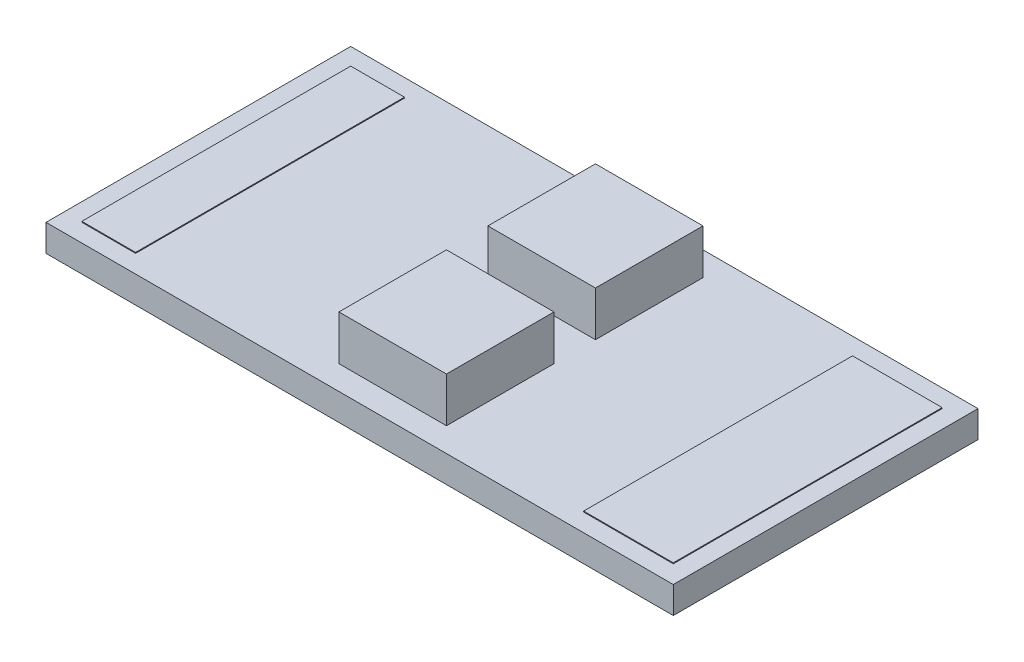
ISO-10303-21;
HEADER;
FILE_DESCRIPTION(('STEP AP214'),'2;1');
FILE_NAME('part.step','',(''),(''),'','','');
FILE_SCHEMA(('AUTOMOTIVE_DESIGN { 1 0 10303 214 1 1 1 1 }'));
ENDSEC;
DATA;
#1=APPLICATION_CONTEXT('core data for automotive mechanical design processes');
#2=APPLICATION_PROTOCOL_DEFINITION('international standard','automotive_design',2000,#1);
#3=PRODUCT_CONTEXT('',#1,'mechanical');
#4=PRODUCT('Part','Part','',(#3));
#5=PRODUCT_RELATED_PRODUCT_CATEGORY('part','',(#4));
#6=PRODUCT_DEFINITION_FORMATION('','',#4);
#7=PRODUCT_DEFINITION_CONTEXT('part definition',#1,'design');
#8=PRODUCT_DEFINITION('design','',#6,#7);
#9=PRODUCT_DEFINITION_SHAPE('','',#8);
#10=(LENGTH_UNIT() NAMED_UNIT(*) SI_UNIT(.MILLI.,.METRE.));
#11=(NAMED_UNIT(*) PLANE_ANGLE_UNIT() SI_UNIT($,.RADIAN.));
#12=(NAMED_UNIT(*) SI_UNIT($,.STERADIAN.) SOLID_ANGLE_UNIT());
#13=UNCERTAINTY_MEASURE_WITH_UNIT(LENGTH_MEASURE(1.E-05),#10,'distance_accuracy_value','');
#14=(GEOMETRIC_REPRESENTATION_CONTEXT(3) GLOBAL_UNCERTAINTY_ASSIGNED_CONTEXT((#13)) GLOBAL_UNIT_ASSIGNED_CONTEXT((#10,
#11,#12)) REPRESENTATION_CONTEXT('',''));
#15=CARTESIAN_POINT('',(0.,0.,0.));
#16=DIRECTION('',(0.,0.,1.));
#17=DIRECTION('',(1.,0.,0.));
#18=AXIS2_PLACEMENT_3D('',#15,#16,#17);
#19=CARTESIAN_POINT('',(0.,1.5,0.));
#20=DIRECTION('',(0.,-1.,0.));
#21=DIRECTION('',(0.,0.,-1.));
#22=AXIS2_PLACEMENT_3D('',#19,#20,#21);
#23=PLANE('',#22);
#24=DIRECTION('',(1.,0.,0.));
#25=VECTOR('',#24,1.);
#26=CARTESIAN_POINT('',(0.,1.5,7.5));
#27=LINE('',#26,#25);
#28=CARTESIAN_POINT('',(-6.,1.5,7.5));
#29=VERTEX_POINT('',#28);
#30=CARTESIAN_POINT('',(-1.,1.5,7.5));
#31=VERTEX_POINT('',#30);
#32=EDGE_CURVE('E242',#29,#31,#27,.T.);
#33=ORIENTED_EDGE('',*,*,#32,.F.);
#34=DIRECTION('',(0.,0.,1.));
#35=VECTOR('',#34,1.);
#36=CARTESIAN_POINT('',(-6.,1.5,0.));
#37=LINE('',#36,#35);
#38=CARTESIAN_POINT('',(-6.,1.5,-7.5));
#39=VERTEX_POINT('',#38);
#40=EDGE_CURVE('E239',#39,#29,#37,.T.);
#41=ORIENTED_EDGE('',*,*,#40,.F.);
#42=DIRECTION('',(-1.,0.,0.));
#43=VECTOR('',#42,1.);
#44=CARTESIAN_POINT('',(0.,1.5,-7.5));
#45=LINE('',#44,#43);
#46=CARTESIAN_POINT('',(-1.,1.5,-7.5));
#47=VERTEX_POINT('',#46);
#48=EDGE_CURVE('E236',#47,#39,#45,.T.);
#49=ORIENTED_EDGE('',*,*,#48,.F.);
#50=DIRECTION('',(0.,0.,-1.));
#51=VECTOR('',#50,1.);
#52=CARTESIAN_POINT('',(-1.,1.5,0.));
#53=LINE('',#52,#51);
#54=EDGE_CURVE('E220',#31,#47,#53,.T.);
#55=ORIENTED_EDGE('',*,*,#54,.F.);
#56=EDGE_LOOP('',(#33,#41,#49,#55));
#57=FACE_BOUND('',#56,.T.);
#58=DIRECTION('',(0.,0.,1.));
#59=VECTOR('',#58,1.);
#60=CARTESIAN_POINT('',(-20.,1.5,0.));
#61=LINE('',#60,#59);
#62=CARTESIAN_POINT('',(-20.,1.5,-7.15661560895147));
#63=VERTEX_POINT('',#62);
#64=CARTESIAN_POINT('',(-20.,1.5,-1.15661560895147));
#65=VERTEX_POINT('',#64);
#66=EDGE_CURVE('E308',#63,#65,#61,.T.);
#67=ORIENTED_EDGE('',*,*,#66,.F.);
#68=DIRECTION('',(-1.,0.,0.));
#69=VECTOR('',#68,1.);
#70=CARTESIAN_POINT('',(0.,1.5,-7.15661560895147));
#71=LINE('',#70,#69);
#72=CARTESIAN_POINT('',(-14.,1.5,-7.15661560895147));
#73=VERTEX_POINT('',#72);
#74=EDGE_CURVE('E299',#73,#63,#71,.T.);
#75=ORIENTED_EDGE('',*,*,#74,.F.);
#76=DIRECTION('',(0.,0.,-1.));
#77=VECTOR('',#76,1.);
#78=CARTESIAN_POINT('',(-14.,1.5,0.));
#79=LINE('',#78,#77);
#80=CARTESIAN_POINT('',(-14.,1.5,-1.15661560895147));
#81=VERTEX_POINT('',#80);
#82=EDGE_CURVE('E302',#81,#73,#79,.T.);
#83=ORIENTED_EDGE('',*,*,#82,.F.);
#84=DIRECTION('',(1.,0.,0.));
#85=VECTOR('',#84,1.);
#86=CARTESIAN_POINT('',(0.,1.5,-1.15661560895147));
#87=LINE('',#86,#85);
#88=EDGE_CURVE('E305',#65,#81,#87,.T.);
#89=ORIENTED_EDGE('',*,*,#88,.F.);
#90=EDGE_LOOP('',(#67,#75,#83,#89));
#91=FACE_BOUND('',#90,.T.);
#92=DIRECTION('',(0.,0.,-1.));
#93=VECTOR('',#92,1.);
#94=CARTESIAN_POINT('',(0.,1.5,-8.5));
#95=LINE('',#94,#93);
#96=CARTESIAN_POINT('',(0.,1.5,8.5));
#97=VERTEX_POINT('',#96);
#98=CARTESIAN_POINT('',(0.,1.5,-8.5));
#99=VERTEX_POINT('',#98);
#100=EDGE_CURVE('E312',#97,#99,#95,.T.);
#101=ORIENTED_EDGE('',*,*,#100,.T.);
#102=DIRECTION('',(-1.,0.,0.));
#103=VECTOR('',#102,1.);
#104=CARTESIAN_POINT('',(0.,1.5,-8.5));
#105=LINE('',#104,#103);
#106=CARTESIAN_POINT('',(-35.,1.5,-8.49999999999998));
#107=VERTEX_POINT('',#106);
#108=EDGE_CURVE('E315',#99,#107,#105,.T.);
#109=ORIENTED_EDGE('',*,*,#108,.T.);
#110=DIRECTION('',(0.,0.,1.));
#111=VECTOR('',#110,1.);
#112=CARTESIAN_POINT('',(-35.,1.5,-8.49999999999998));
#113=LINE('',#112,#111);
#114=CARTESIAN_POINT('',(-35.,1.5,8.5));
#115=VERTEX_POINT('',#114);
#116=EDGE_CURVE('E318',#107,#115,#113,.T.);
#117=ORIENTED_EDGE('',*,*,#116,.T.);
#118=DIRECTION('',(1.,0.,0.));
#119=VECTOR('',#118,1.);
#120=CARTESIAN_POINT('',(0.,1.5,8.5));
#121=LINE('',#120,#119);
#122=EDGE_CURVE('E320',#115,#97,#121,.T.);
#123=ORIENTED_EDGE('',*,*,#122,.T.);
#124=EDGE_LOOP('',(#101,#109,#117,#123));
#125=FACE_BOUND('',#124,.T.);
#126=DIRECTION('',(0.,0.,1.));
#127=VECTOR('',#126,1.);
#128=CARTESIAN_POINT('',(-20.,1.5,0.));
#129=LINE('',#128,#127);
#130=CARTESIAN_POINT('',(-20.,1.5,1.15661560895147));
#131=VERTEX_POINT('',#130);
#132=CARTESIAN_POINT('',(-20.,1.5,7.15661560895147));
#133=VERTEX_POINT('',#132);
#134=EDGE_CURVE('E275',#131,#133,#129,.T.);
#135=ORIENTED_EDGE('',*,*,#134,.F.);
#136=DIRECTION('',(-1.,0.,0.));
#137=VECTOR('',#136,1.);
#138=CARTESIAN_POINT('',(0.,1.5,1.15661560895148));
#139=LINE('',#138,#137);
#140=CARTESIAN_POINT('',(-14.,1.5,1.15661560895147));
#141=VERTEX_POINT('',#140);
#142=EDGE_CURVE('E266',#141,#131,#139,.T.);
#143=ORIENTED_EDGE('',*,*,#142,.F.);
#144=DIRECTION('',(0.,0.,-1.));
#145=VECTOR('',#144,1.);
#146=CARTESIAN_POINT('',(-14.,1.5,0.));
#147=LINE('',#146,#145);
#148=CARTESIAN_POINT('',(-14.,1.5,7.15661560895147));
#149=VERTEX_POINT('',#148);
#150=EDGE_CURVE('E269',#149,#141,#147,.T.);
#151=ORIENTED_EDGE('',*,*,#150,.F.);
#152=DIRECTION('',(1.,0.,0.));
#153=VECTOR('',#152,1.);
#154=CARTESIAN_POINT('',(0.,1.5,7.15661560895148));
#155=LINE('',#154,#153);
#156=EDGE_CURVE('E272',#133,#149,#155,.T.);
#157=ORIENTED_EDGE('',*,*,#156,.F.);
#158=EDGE_LOOP('',(#135,#143,#151,#157));
#159=FACE_BOUND('',#158,.T.);
#160=DIRECTION('',(-1.,0.,0.));
#161=VECTOR('',#160,1.);
#162=CARTESIAN_POINT('',(0.,1.5,-7.49999999999998));
#163=LINE('',#162,#161);
#164=CARTESIAN_POINT('',(-31.,1.5,-7.49999999999998));
#165=VERTEX_POINT('',#164);
#166=CARTESIAN_POINT('',(-34.,1.5,-7.49999999999998));
#167=VERTEX_POINT('',#166);
#168=EDGE_CURVE('E54',#165,#167,#163,.T.);
#169=ORIENTED_EDGE('',*,*,#168,.F.);
#170=DIRECTION('',(0.,0.,-1.));
#171=VECTOR('',#170,1.);
#172=CARTESIAN_POINT('',(-31.,1.5,0.));
#173=LINE('',#172,#171);
#174=CARTESIAN_POINT('',(-31.,1.5,7.5));
#175=VERTEX_POINT('',#174);
#176=EDGE_CURVE('E58',#175,#165,#173,.T.);
#177=ORIENTED_EDGE('',*,*,#176,.F.);
#178=DIRECTION('',(1.,0.,0.));
#179=VECTOR('',#178,1.);
#180=CARTESIAN_POINT('',(0.,1.5,7.50000000000001));
#181=LINE('',#180,#179);
#182=CARTESIAN_POINT('',(-34.,1.5,7.5));
#183=VERTEX_POINT('',#182);
#184=EDGE_CURVE('E204',#183,#175,#181,.T.);
#185=ORIENTED_EDGE('',*,*,#184,.F.);
#186=DIRECTION('',(0.,0.,1.));
#187=VECTOR('',#186,1.);
#188=CARTESIAN_POINT('',(-34.,1.5,0.));
#189=LINE('',#188,#187);
#190=EDGE_CURVE('E201',#167,#183,#189,.T.);
#191=ORIENTED_EDGE('',*,*,#190,.F.);
#192=EDGE_LOOP('',(#169,#177,#185,#191));
#193=FACE_BOUND('',#192,.T.);
#194=ADVANCED_FACE('F39',(#57,#91,#125,#159,#193),#23,.F.);
#195=CARTESIAN_POINT('',(0.,1.5,-8.5));
#196=DIRECTION('',(-1.,0.,0.));
#197=DIRECTION('',(0.,0.,1.));
#198=AXIS2_PLACEMENT_3D('',#195,#196,#197);
#199=PLANE('',#198);
#200=DIRECTION('',(0.,0.,-1.));
#201=VECTOR('',#200,1.);
#202=CARTESIAN_POINT('',(0.,0.,-8.5));
#203=LINE('',#202,#201);
#204=CARTESIAN_POINT('',(0.,0.,8.5));
#205=VERTEX_POINT('',#204);
#206=CARTESIAN_POINT('',(0.,0.,-8.5));
#207=VERTEX_POINT('',#206);
#208=EDGE_CURVE('E311',#205,#207,#203,.T.);
#209=ORIENTED_EDGE('',*,*,#208,.T.);
#210=DIRECTION('',(0.,-1.,0.));
#211=VECTOR('',#210,1.);
#212=CARTESIAN_POINT('',(0.,1.5,-8.5));
#213=LINE('',#212,#211);
#214=EDGE_CURVE('E12',#99,#207,#213,.T.);
#215=ORIENTED_EDGE('',*,*,#214,.F.);
#216=ORIENTED_EDGE('',*,*,#100,.F.);
#217=DIRECTION('',(0.,-1.,0.));
#218=VECTOR('',#217,1.);
#219=CARTESIAN_POINT('',(0.,1.5,8.5));
#220=LINE('',#219,#218);
#221=EDGE_CURVE('E322',#97,#205,#220,.T.);
#222=ORIENTED_EDGE('',*,*,#221,.T.);
#223=EDGE_LOOP('',(#209,#215,#216,#222));
#224=FACE_BOUND('',#223,.T.);
#225=ADVANCED_FACE('F41',(#224),#199,.F.);
#226=CARTESIAN_POINT('',(0.,1.5,-8.5));
#227=DIRECTION('',(0.,0.,1.));
#228=DIRECTION('',(1.,0.,0.));
#229=AXIS2_PLACEMENT_3D('',#226,#227,#228);
#230=PLANE('',#229);
#231=DIRECTION('',(-1.,0.,0.));
#232=VECTOR('',#231,1.);
#233=CARTESIAN_POINT('',(0.,0.,-8.5));
#234=LINE('',#233,#232);
#235=CARTESIAN_POINT('',(-35.,0.,-8.49999999999998));
#236=VERTEX_POINT('',#235);
#237=EDGE_CURVE('E325',#207,#236,#234,.T.);
#238=ORIENTED_EDGE('',*,*,#237,.T.);
#239=DIRECTION('',(0.,-1.,0.));
#240=VECTOR('',#239,1.);
#241=CARTESIAN_POINT('',(-35.,1.5,-8.49999999999998));
#242=LINE('',#241,#240);
#243=EDGE_CURVE('E47',#107,#236,#242,.T.);
#244=ORIENTED_EDGE('',*,*,#243,.F.);
#245=ORIENTED_EDGE('',*,*,#108,.F.);
#246=ORIENTED_EDGE('',*,*,#214,.T.);
#247=EDGE_LOOP('',(#238,#244,#245,#246));
#248=FACE_BOUND('',#247,.T.);
#249=ADVANCED_FACE('F355',(#248),#230,.F.);
#250=CARTESIAN_POINT('',(-35.,1.5,-8.49999999999998));
#251=DIRECTION('',(1.,0.,0.));
#252=DIRECTION('',(0.,0.,-1.));
#253=AXIS2_PLACEMENT_3D('',#250,#251,#252);
#254=PLANE('',#253);
#255=DIRECTION('',(0.,0.,1.));
#256=VECTOR('',#255,1.);
#257=CARTESIAN_POINT('',(-35.,0.,-8.49999999999998));
#258=LINE('',#257,#256);
#259=CARTESIAN_POINT('',(-35.,0.,8.5));
#260=VERTEX_POINT('',#259);
#261=EDGE_CURVE('E327',#236,#260,#258,.T.);
#262=ORIENTED_EDGE('',*,*,#261,.T.);
#263=DIRECTION('',(0.,-1.,0.));
#264=VECTOR('',#263,1.);
#265=CARTESIAN_POINT('',(-35.,1.5,8.5));
#266=LINE('',#265,#264);
#267=EDGE_CURVE('E332',#115,#260,#266,.T.);
#268=ORIENTED_EDGE('',*,*,#267,.F.);
#269=ORIENTED_EDGE('',*,*,#116,.F.);
#270=ORIENTED_EDGE('',*,*,#243,.T.);
#271=EDGE_LOOP('',(#262,#268,#269,#270));
#272=FACE_BOUND('',#271,.T.);
#273=ADVANCED_FACE('F339',(#272),#254,.F.);
#274=CARTESIAN_POINT('',(0.,1.5,8.5));
#275=DIRECTION('',(0.,0.,-1.));
#276=DIRECTION('',(-1.,0.,0.));
#277=AXIS2_PLACEMENT_3D('',#274,#275,#276);
#278=PLANE('',#277);
#279=DIRECTION('',(1.,0.,0.));
#280=VECTOR('',#279,1.);
#281=CARTESIAN_POINT('',(0.,0.,8.5));
#282=LINE('',#281,#280);
#283=EDGE_CURVE('E316',#260,#205,#282,.T.);
#284=ORIENTED_EDGE('',*,*,#283,.T.);
#285=ORIENTED_EDGE('',*,*,#221,.F.);
#286=ORIENTED_EDGE('',*,*,#122,.F.);
#287=ORIENTED_EDGE('',*,*,#267,.T.);
#288=EDGE_LOOP('',(#284,#285,#286,#287));
#289=FACE_BOUND('',#288,.T.);
#290=ADVANCED_FACE('F348',(#289),#278,.F.);
#291=CARTESIAN_POINT('',(0.,0.,0.));
#292=DIRECTION('',(0.,-1.,0.));
#293=DIRECTION('',(0.,0.,-1.));
#294=AXIS2_PLACEMENT_3D('',#291,#292,#293);
#295=PLANE('',#294);
#296=ORIENTED_EDGE('',*,*,#208,.F.);
#297=ORIENTED_EDGE('',*,*,#283,.F.);
#298=ORIENTED_EDGE('',*,*,#261,.F.);
#299=ORIENTED_EDGE('',*,*,#237,.F.);
#300=EDGE_LOOP('',(#296,#297,#298,#299));
#301=FACE_BOUND('',#300,.T.);
#302=ADVANCED_FACE('F345',(#301),#295,.T.);
#303=CARTESIAN_POINT('',(-20.,4.,-7.15661560895147));
#304=DIRECTION('',(1.,0.,0.));
#305=DIRECTION('',(0.,0.,-1.));
#306=AXIS2_PLACEMENT_3D('',#303,#304,#305);
#307=PLANE('',#306);
#308=DIRECTION('',(0.,-1.,0.));
#309=VECTOR('',#308,1.);
#310=CARTESIAN_POINT('',(-20.,4.,-7.15661560895147));
#311=LINE('',#310,#309);
#312=CARTESIAN_POINT('',(-20.,4.,-7.15661560895147));
#313=VERTEX_POINT('',#312);
#314=EDGE_CURVE('E287',#313,#63,#311,.T.);
#315=ORIENTED_EDGE('',*,*,#314,.T.);
#316=ORIENTED_EDGE('',*,*,#66,.T.);
#317=DIRECTION('',(0.,-1.,0.));
#318=VECTOR('',#317,1.);
#319=CARTESIAN_POINT('',(-20.,4.,-1.15661560895147));
#320=LINE('',#319,#318);
#321=CARTESIAN_POINT('',(-20.,4.,-1.15661560895147));
#322=VERTEX_POINT('',#321);
#323=EDGE_CURVE('E296',#322,#65,#320,.T.);
#324=ORIENTED_EDGE('',*,*,#323,.F.);
#325=DIRECTION('',(0.,0.,1.));
#326=VECTOR('',#325,1.);
#327=CARTESIAN_POINT('',(-20.,4.,-7.15661560895147));
#328=LINE('',#327,#326);
#329=EDGE_CURVE('E278',#313,#322,#328,.T.);
#330=ORIENTED_EDGE('',*,*,#329,.F.);
#331=EDGE_LOOP('',(#315,#316,#324,#330));
#332=FACE_BOUND('',#331,.T.);
#333=ADVANCED_FACE('F372',(#332),#307,.F.);
#334=CARTESIAN_POINT('',(-20.,4.,-1.15661560895147));
#335=DIRECTION('',(0.,0.,-1.));
#336=DIRECTION('',(-1.,0.,0.));
#337=AXIS2_PLACEMENT_3D('',#334,#335,#336);
#338=PLANE('',#337);
#339=ORIENTED_EDGE('',*,*,#323,.T.);
#340=ORIENTED_EDGE('',*,*,#88,.T.);
#341=DIRECTION('',(0.,-1.,0.));
#342=VECTOR('',#341,1.);
#343=CARTESIAN_POINT('',(-14.,4.,-1.15661560895147));
#344=LINE('',#343,#342);
#345=CARTESIAN_POINT('',(-14.,4.,-1.15661560895147));
#346=VERTEX_POINT('',#345);
#347=EDGE_CURVE('E293',#346,#81,#344,.T.);
#348=ORIENTED_EDGE('',*,*,#347,.F.);
#349=DIRECTION('',(1.,0.,0.));
#350=VECTOR('',#349,1.);
#351=CARTESIAN_POINT('',(-20.,4.,-1.15661560895147));
#352=LINE('',#351,#350);
#353=EDGE_CURVE('E281',#322,#346,#352,.T.);
#354=ORIENTED_EDGE('',*,*,#353,.F.);
#355=EDGE_LOOP('',(#339,#340,#348,#354));
#356=FACE_BOUND('',#355,.T.);
#357=ADVANCED_FACE('F394',(#356),#338,.F.);
#358=CARTESIAN_POINT('',(-14.,4.,-7.15661560895147));
#359=DIRECTION('',(-1.,0.,0.));
#360=DIRECTION('',(0.,0.,1.));
#361=AXIS2_PLACEMENT_3D('',#358,#359,#360);
#362=PLANE('',#361);
#363=ORIENTED_EDGE('',*,*,#347,.T.);
#364=ORIENTED_EDGE('',*,*,#82,.T.);
#365=DIRECTION('',(0.,-1.,0.));
#366=VECTOR('',#365,1.);
#367=CARTESIAN_POINT('',(-14.,4.,-7.15661560895147));
#368=LINE('',#367,#366);
#369=CARTESIAN_POINT('',(-14.,4.,-7.15661560895147));
#370=VERTEX_POINT('',#369);
#371=EDGE_CURVE('E290',#370,#73,#368,.T.);
#372=ORIENTED_EDGE('',*,*,#371,.F.);
#373=DIRECTION('',(0.,0.,-1.));
#374=VECTOR('',#373,1.);
#375=CARTESIAN_POINT('',(-14.,4.,-7.15661560895147));
#376=LINE('',#375,#374);
#377=EDGE_CURVE('E283',#346,#370,#376,.T.);
#378=ORIENTED_EDGE('',*,*,#377,.F.);
#379=EDGE_LOOP('',(#363,#364,#372,#378));
#380=FACE_BOUND('',#379,.T.);
#381=ADVANCED_FACE('F400',(#380),#362,.F.);
#382=CARTESIAN_POINT('',(-20.,4.,-7.15661560895147));
#383=DIRECTION('',(0.,0.,1.));
#384=DIRECTION('',(1.,0.,0.));
#385=AXIS2_PLACEMENT_3D('',#382,#383,#384);
#386=PLANE('',#385);
#387=ORIENTED_EDGE('',*,*,#371,.T.);
#388=ORIENTED_EDGE('',*,*,#74,.T.);
#389=ORIENTED_EDGE('',*,*,#314,.F.);
#390=DIRECTION('',(-1.,0.,0.));
#391=VECTOR('',#390,1.);
#392=CARTESIAN_POINT('',(-20.,4.,-7.15661560895147));
#393=LINE('',#392,#391);
#394=EDGE_CURVE('E285',#370,#313,#393,.T.);
#395=ORIENTED_EDGE('',*,*,#394,.F.);
#396=EDGE_LOOP('',(#387,#388,#389,#395));
#397=FACE_BOUND('',#396,.T.);
#398=ADVANCED_FACE('F407',(#397),#386,.F.);
#399=CARTESIAN_POINT('',(0.,4.,0.));
#400=DIRECTION('',(0.,1.,0.));
#401=DIRECTION('',(0.,0.,1.));
#402=AXIS2_PLACEMENT_3D('',#399,#400,#401);
#403=PLANE('',#402);
#404=ORIENTED_EDGE('',*,*,#329,.T.);
#405=ORIENTED_EDGE('',*,*,#353,.T.);
#406=ORIENTED_EDGE('',*,*,#377,.T.);
#407=ORIENTED_EDGE('',*,*,#394,.T.);
#408=EDGE_LOOP('',(#404,#405,#406,#407));
#409=FACE_BOUND('',#408,.T.);
#410=ADVANCED_FACE('F415',(#409),#403,.T.);
#411=CARTESIAN_POINT('',(-20.,4.,7.15661560895147));
#412=DIRECTION('',(1.,0.,0.));
#413=DIRECTION('',(0.,0.,-1.));
#414=AXIS2_PLACEMENT_3D('',#411,#412,#413);
#415=PLANE('',#414);
#416=DIRECTION('',(0.,-1.,0.));
#417=VECTOR('',#416,1.);
#418=CARTESIAN_POINT('',(-20.,4.,1.15661560895147));
#419=LINE('',#418,#417);
#420=CARTESIAN_POINT('',(-20.,4.,1.15661560895147));
#421=VERTEX_POINT('',#420);
#422=EDGE_CURVE('E254',#421,#131,#419,.T.);
#423=ORIENTED_EDGE('',*,*,#422,.T.);
#424=ORIENTED_EDGE('',*,*,#134,.T.);
#425=DIRECTION('',(0.,-1.,0.));
#426=VECTOR('',#425,1.);
#427=CARTESIAN_POINT('',(-20.,4.,7.15661560895147));
#428=LINE('',#427,#426);
#429=CARTESIAN_POINT('',(-20.,4.,7.15661560895147));
#430=VERTEX_POINT('',#429);
#431=EDGE_CURVE('E263',#430,#133,#428,.T.);
#432=ORIENTED_EDGE('',*,*,#431,.F.);
#433=DIRECTION('',(0.,0.,1.));
#434=VECTOR('',#433,1.);
#435=CARTESIAN_POINT('',(-20.,4.,7.15661560895147));
#436=LINE('',#435,#434);
#437=EDGE_CURVE('E245',#421,#430,#436,.T.);
#438=ORIENTED_EDGE('',*,*,#437,.F.);
#439=EDGE_LOOP('',(#423,#424,#432,#438));
#440=FACE_BOUND('',#439,.T.);
#441=ADVANCED_FACE('F423',(#440),#415,.F.);
#442=CARTESIAN_POINT('',(-20.,4.,7.15661560895147));
#443=DIRECTION('',(0.,0.,-1.));
#444=DIRECTION('',(-1.,0.,0.));
#445=AXIS2_PLACEMENT_3D('',#442,#443,#444);
#446=PLANE('',#445);
#447=ORIENTED_EDGE('',*,*,#431,.T.);
#448=ORIENTED_EDGE('',*,*,#156,.T.);
#449=DIRECTION('',(0.,-1.,0.));
#450=VECTOR('',#449,1.);
#451=CARTESIAN_POINT('',(-14.,4.,7.15661560895147));
#452=LINE('',#451,#450);
#453=CARTESIAN_POINT('',(-14.,4.,7.15661560895147));
#454=VERTEX_POINT('',#453);
#455=EDGE_CURVE('E260',#454,#149,#452,.T.);
#456=ORIENTED_EDGE('',*,*,#455,.F.);
#457=DIRECTION('',(1.,0.,0.));
#458=VECTOR('',#457,1.);
#459=CARTESIAN_POINT('',(-20.,4.,7.15661560895147));
#460=LINE('',#459,#458);
#461=EDGE_CURVE('E248',#430,#454,#460,.T.);
#462=ORIENTED_EDGE('',*,*,#461,.F.);
#463=EDGE_LOOP('',(#447,#448,#456,#462));
#464=FACE_BOUND('',#463,.T.);
#465=ADVANCED_FACE('F431',(#464),#446,.F.);
#466=CARTESIAN_POINT('',(-14.,4.,7.15661560895147));
#467=DIRECTION('',(-1.,0.,0.));
#468=DIRECTION('',(0.,0.,1.));
#469=AXIS2_PLACEMENT_3D('',#466,#467,#468);
#470=PLANE('',#469);
#471=ORIENTED_EDGE('',*,*,#455,.T.);
#472=ORIENTED_EDGE('',*,*,#150,.T.);
#473=DIRECTION('',(0.,-1.,0.));
#474=VECTOR('',#473,1.);
#475=CARTESIAN_POINT('',(-14.,4.,1.15661560895147));
#476=LINE('',#475,#474);
#477=CARTESIAN_POINT('',(-14.,4.,1.15661560895147));
#478=VERTEX_POINT('',#477);
#479=EDGE_CURVE('E257',#478,#141,#476,.T.);
#480=ORIENTED_EDGE('',*,*,#479,.F.);
#481=DIRECTION('',(0.,0.,-1.));
#482=VECTOR('',#481,1.);
#483=CARTESIAN_POINT('',(-14.,4.,7.15661560895147));
#484=LINE('',#483,#482);
#485=EDGE_CURVE('E250',#454,#478,#484,.T.);
#486=ORIENTED_EDGE('',*,*,#485,.F.);
#487=EDGE_LOOP('',(#471,#472,#480,#486));
#488=FACE_BOUND('',#487,.T.);
#489=ADVANCED_FACE('F439',(#488),#470,.F.);
#490=CARTESIAN_POINT('',(-20.,4.,1.15661560895147));
#491=DIRECTION('',(0.,0.,1.));
#492=DIRECTION('',(1.,0.,0.));
#493=AXIS2_PLACEMENT_3D('',#490,#491,#492);
#494=PLANE('',#493);
#495=ORIENTED_EDGE('',*,*,#479,.T.);
#496=ORIENTED_EDGE('',*,*,#142,.T.);
#497=ORIENTED_EDGE('',*,*,#422,.F.);
#498=DIRECTION('',(-1.,0.,0.));
#499=VECTOR('',#498,1.);
#500=CARTESIAN_POINT('',(-20.,4.,1.15661560895147));
#501=LINE('',#500,#499);
#502=EDGE_CURVE('E252',#478,#421,#501,.T.);
#503=ORIENTED_EDGE('',*,*,#502,.F.);
#504=EDGE_LOOP('',(#495,#496,#497,#503));
#505=FACE_BOUND('',#504,.T.);
#506=ADVANCED_FACE('F447',(#505),#494,.F.);
#507=CARTESIAN_POINT('',(0.,4.,0.));
#508=DIRECTION('',(0.,-1.,0.));
#509=DIRECTION('',(0.,0.,-1.));
#510=AXIS2_PLACEMENT_3D('',#507,#508,#509);
#511=PLANE('',#510);
#512=ORIENTED_EDGE('',*,*,#437,.T.);
#513=ORIENTED_EDGE('',*,*,#461,.T.);
#514=ORIENTED_EDGE('',*,*,#485,.T.);
#515=ORIENTED_EDGE('',*,*,#502,.T.);
#516=EDGE_LOOP('',(#512,#513,#514,#515));
#517=FACE_BOUND('',#516,.T.);
#518=ADVANCED_FACE('F455',(#517),#511,.F.);
#519=CARTESIAN_POINT('',(-1.,17.4113883008419,7.5));
#520=DIRECTION('',(0.,0.,-1.));
#521=DIRECTION('',(-1.,0.,0.));
#522=AXIS2_PLACEMENT_3D('',#519,#520,#521);
#523=PLANE('',#522);
#524=DIRECTION('',(0.,-1.,0.));
#525=VECTOR('',#524,1.);
#526=CARTESIAN_POINT('',(-6.,17.4113883008419,7.5));
#527=LINE('',#526,#525);
#528=CARTESIAN_POINT('',(-6.,1.55,7.5));
#529=VERTEX_POINT('',#528);
#530=EDGE_CURVE('E223',#529,#29,#527,.T.);
#531=ORIENTED_EDGE('',*,*,#530,.T.);
#532=ORIENTED_EDGE('',*,*,#32,.T.);
#533=DIRECTION('',(0.,-1.,0.));
#534=VECTOR('',#533,1.);
#535=CARTESIAN_POINT('',(-1.,17.4113883008419,7.5));
#536=LINE('',#535,#534);
#537=CARTESIAN_POINT('',(-1.,1.55,7.5));
#538=VERTEX_POINT('',#537);
#539=EDGE_CURVE('E209',#538,#31,#536,.T.);
#540=ORIENTED_EDGE('',*,*,#539,.F.);
#541=DIRECTION('',(-1.,0.,0.));
#542=VECTOR('',#541,1.);
#543=CARTESIAN_POINT('',(-1.,1.55,7.5));
#544=LINE('',#543,#542);
#545=EDGE_CURVE('E214',#538,#529,#544,.T.);
#546=ORIENTED_EDGE('',*,*,#545,.T.);
#547=EDGE_LOOP('',(#531,#532,#540,#546));
#548=FACE_BOUND('',#547,.T.);
#549=ADVANCED_FACE('F461',(#548),#523,.F.);
#550=CARTESIAN_POINT('',(-6.,17.4113883008419,-7.5));
#551=DIRECTION('',(1.,0.,0.));
#552=DIRECTION('',(0.,0.,-1.));
#553=AXIS2_PLACEMENT_3D('',#550,#551,#552);
#554=PLANE('',#553);
#555=DIRECTION('',(0.,-1.,0.));
#556=VECTOR('',#555,1.);
#557=CARTESIAN_POINT('',(-6.,17.4113883008419,-7.5));
#558=LINE('',#557,#556);
#559=CARTESIAN_POINT('',(-6.,1.55,-7.5));
#560=VERTEX_POINT('',#559);
#561=EDGE_CURVE('E226',#560,#39,#558,.T.);
#562=ORIENTED_EDGE('',*,*,#561,.T.);
#563=ORIENTED_EDGE('',*,*,#40,.T.);
#564=ORIENTED_EDGE('',*,*,#530,.F.);
#565=DIRECTION('',(0.,0.,-1.));
#566=VECTOR('',#565,1.);
#567=CARTESIAN_POINT('',(-6.,1.55,-7.5));
#568=LINE('',#567,#566);
#569=EDGE_CURVE('E210',#529,#560,#568,.T.);
#570=ORIENTED_EDGE('',*,*,#569,.T.);
#571=EDGE_LOOP('',(#562,#563,#564,#570));
#572=FACE_BOUND('',#571,.T.);
#573=ADVANCED_FACE('F474',(#572),#554,.F.);
#574=CARTESIAN_POINT('',(-1.,17.4113883008419,-7.5));
#575=DIRECTION('',(0.,0.,1.));
#576=DIRECTION('',(1.,0.,0.));
#577=AXIS2_PLACEMENT_3D('',#574,#575,#576);
#578=PLANE('',#577);
#579=DIRECTION('',(0.,-1.,0.));
#580=VECTOR('',#579,1.);
#581=CARTESIAN_POINT('',(-1.,17.4113883008419,-7.5));
#582=LINE('',#581,#580);
#583=CARTESIAN_POINT('',(-1.,1.55,-7.5));
#584=VERTEX_POINT('',#583);
#585=EDGE_CURVE('E229',#584,#47,#582,.T.);
#586=ORIENTED_EDGE('',*,*,#585,.T.);
#587=ORIENTED_EDGE('',*,*,#48,.T.);
#588=ORIENTED_EDGE('',*,*,#561,.F.);
#589=DIRECTION('',(1.,0.,0.));
#590=VECTOR('',#589,1.);
#591=CARTESIAN_POINT('',(-1.,1.55,-7.5));
#592=LINE('',#591,#590);
#593=EDGE_CURVE('E213',#560,#584,#592,.T.);
#594=ORIENTED_EDGE('',*,*,#593,.T.);
#595=EDGE_LOOP('',(#586,#587,#588,#594));
#596=FACE_BOUND('',#595,.T.);
#597=ADVANCED_FACE('F481',(#596),#578,.F.);
#598=CARTESIAN_POINT('',(-1.,17.4113883008419,-7.5));
#599=DIRECTION('',(-1.,0.,0.));
#600=DIRECTION('',(0.,0.,1.));
#601=AXIS2_PLACEMENT_3D('',#598,#599,#600);
#602=PLANE('',#601);
#603=ORIENTED_EDGE('',*,*,#539,.T.);
#604=ORIENTED_EDGE('',*,*,#54,.T.);
#605=ORIENTED_EDGE('',*,*,#585,.F.);
#606=DIRECTION('',(0.,0.,1.));
#607=VECTOR('',#606,1.);
#608=CARTESIAN_POINT('',(-1.,1.55,-7.5));
#609=LINE('',#608,#607);
#610=EDGE_CURVE('E217',#584,#538,#609,.T.);
#611=ORIENTED_EDGE('',*,*,#610,.T.);
#612=EDGE_LOOP('',(#603,#604,#605,#611));
#613=FACE_BOUND('',#612,.T.);
#614=ADVANCED_FACE('F489',(#613),#602,.F.);
#615=CARTESIAN_POINT('',(0.,1.55,0.));
#616=DIRECTION('',(0.,-1.,0.));
#617=DIRECTION('',(0.,0.,-1.));
#618=AXIS2_PLACEMENT_3D('',#615,#616,#617);
#619=PLANE('',#618);
#620=ORIENTED_EDGE('',*,*,#593,.F.);
#621=ORIENTED_EDGE('',*,*,#569,.F.);
#622=ORIENTED_EDGE('',*,*,#545,.F.);
#623=ORIENTED_EDGE('',*,*,#610,.F.);
#624=EDGE_LOOP('',(#620,#621,#622,#623));
#625=FACE_BOUND('',#624,.T.);
#626=ADVANCED_FACE('F497',(#625),#619,.F.);
#627=CARTESIAN_POINT('',(-34.,17.4113883008419,-7.49999999999998));
#628=DIRECTION('',(0.,0.,1.));
#629=DIRECTION('',(1.,0.,0.));
#630=AXIS2_PLACEMENT_3D('',#627,#628,#629);
#631=PLANE('',#630);
#632=DIRECTION('',(0.,-1.,0.));
#633=VECTOR('',#632,1.);
#634=CARTESIAN_POINT('',(-31.,17.4113883008419,-7.49999999999998));
#635=LINE('',#634,#633);
#636=CARTESIAN_POINT('',(-31.,1.55,-7.49999999999998));
#637=VERTEX_POINT('',#636);
#638=EDGE_CURVE('E186',#637,#165,#635,.T.);
#639=ORIENTED_EDGE('',*,*,#638,.T.);
#640=ORIENTED_EDGE('',*,*,#168,.T.);
#641=DIRECTION('',(0.,-1.,0.));
#642=VECTOR('',#641,1.);
#643=CARTESIAN_POINT('',(-34.,17.4113883008419,-7.49999999999998));
#644=LINE('',#643,#642);
#645=CARTESIAN_POINT('',(-34.,1.55,-7.49999999999998));
#646=VERTEX_POINT('',#645);
#647=EDGE_CURVE('E190',#646,#167,#644,.T.);
#648=ORIENTED_EDGE('',*,*,#647,.F.);
#649=DIRECTION('',(1.,0.,0.));
#650=VECTOR('',#649,1.);
#651=CARTESIAN_POINT('',(-34.,1.55,-7.49999999999998));
#652=LINE('',#651,#650);
#653=EDGE_CURVE('E177',#646,#637,#652,.T.);
#654=ORIENTED_EDGE('',*,*,#653,.T.);
#655=EDGE_LOOP('',(#639,#640,#648,#654));
#656=FACE_BOUND('',#655,.T.);
#657=ADVANCED_FACE('F193',(#656),#631,.F.);
#658=CARTESIAN_POINT('',(-31.,17.4113883008419,-7.49999999999998));
#659=DIRECTION('',(-1.,0.,0.));
#660=DIRECTION('',(0.,0.,1.));
#661=AXIS2_PLACEMENT_3D('',#658,#659,#660);
#662=PLANE('',#661);
#663=DIRECTION('',(0.,-1.,0.));
#664=VECTOR('',#663,1.);
#665=CARTESIAN_POINT('',(-31.,17.4113883008419,7.5));
#666=LINE('',#665,#664);
#667=CARTESIAN_POINT('',(-31.,1.55,7.5));
#668=VERTEX_POINT('',#667);
#669=EDGE_CURVE('E189',#668,#175,#666,.T.);
#670=ORIENTED_EDGE('',*,*,#669,.T.);
#671=ORIENTED_EDGE('',*,*,#176,.T.);
#672=ORIENTED_EDGE('',*,*,#638,.F.);
#673=DIRECTION('',(0.,0.,1.));
#674=VECTOR('',#673,1.);
#675=CARTESIAN_POINT('',(-31.,1.55,-7.49999999999998));
#676=LINE('',#675,#674);
#677=EDGE_CURVE('E173',#637,#668,#676,.T.);
#678=ORIENTED_EDGE('',*,*,#677,.T.);
#679=EDGE_LOOP('',(#670,#671,#672,#678));
#680=FACE_BOUND('',#679,.T.);
#681=ADVANCED_FACE('F187',(#680),#662,.F.);
#682=CARTESIAN_POINT('',(-34.,17.4113883008419,7.5));
#683=DIRECTION('',(0.,0.,-1.));
#684=DIRECTION('',(-1.,0.,0.));
#685=AXIS2_PLACEMENT_3D('',#682,#683,#684);
#686=PLANE('',#685);
#687=DIRECTION('',(0.,-1.,0.));
#688=VECTOR('',#687,1.);
#689=CARTESIAN_POINT('',(-34.,17.4113883008419,7.5));
#690=LINE('',#689,#688);
#691=CARTESIAN_POINT('',(-34.,1.55,7.5));
#692=VERTEX_POINT('',#691);
#693=EDGE_CURVE('E195',#692,#183,#690,.T.);
#694=ORIENTED_EDGE('',*,*,#693,.T.);
#695=ORIENTED_EDGE('',*,*,#184,.T.);
#696=ORIENTED_EDGE('',*,*,#669,.F.);
#697=DIRECTION('',(-1.,0.,0.));
#698=VECTOR('',#697,1.);
#699=CARTESIAN_POINT('',(-34.,1.55,7.5));
#700=LINE('',#699,#698);
#701=EDGE_CURVE('E180',#668,#692,#700,.T.);
#702=ORIENTED_EDGE('',*,*,#701,.T.);
#703=EDGE_LOOP('',(#694,#695,#696,#702));
#704=FACE_BOUND('',#703,.T.);
#705=ADVANCED_FACE('F520',(#704),#686,.F.);
#706=CARTESIAN_POINT('',(-34.,17.4113883008419,-7.49999999999998));
#707=DIRECTION('',(1.,0.,0.));
#708=DIRECTION('',(0.,0.,-1.));
#709=AXIS2_PLACEMENT_3D('',#706,#707,#708);
#710=PLANE('',#709);
#711=ORIENTED_EDGE('',*,*,#647,.T.);
#712=ORIENTED_EDGE('',*,*,#190,.T.);
#713=ORIENTED_EDGE('',*,*,#693,.F.);
#714=DIRECTION('',(0.,0.,-1.));
#715=VECTOR('',#714,1.);
#716=CARTESIAN_POINT('',(-34.,1.55,-7.49999999999998));
#717=LINE('',#716,#715);
#718=EDGE_CURVE('E205',#692,#646,#717,.T.);
#719=ORIENTED_EDGE('',*,*,#718,.T.);
#720=EDGE_LOOP('',(#711,#712,#713,#719));
#721=FACE_BOUND('',#720,.T.);
#722=ADVANCED_FACE('F527',(#721),#710,.F.);
#723=CARTESIAN_POINT('',(0.,1.55,0.));
#724=DIRECTION('',(0.,-1.,0.));
#725=DIRECTION('',(0.,0.,-1.));
#726=AXIS2_PLACEMENT_3D('',#723,#724,#725);
#727=PLANE('',#726);
#728=ORIENTED_EDGE('',*,*,#701,.F.);
#729=ORIENTED_EDGE('',*,*,#677,.F.);
#730=ORIENTED_EDGE('',*,*,#653,.F.);
#731=ORIENTED_EDGE('',*,*,#718,.F.);
#732=EDGE_LOOP('',(#728,#729,#730,#731));
#733=FACE_BOUND('',#732,.T.);
#734=ADVANCED_FACE('F175',(#733),#727,.F.);
#735=CLOSED_SHELL('',(#194,#225,#249,#273,#290,#302,#333,#357,#381,#398,#410,#441,#465,#489,
#506,#518,#549,#573,#597,#614,#626,#657,#681,#705,#722,#734));
#736=MANIFOLD_SOLID_BREP('B2',#735);
#737=ADVANCED_BREP_SHAPE_REPRESENTATION('',(#18,#736),#14);
#738=SHAPE_DEFINITION_REPRESENTATION(#9,#737);
ENDSEC;
END-ISO-10303-21;
